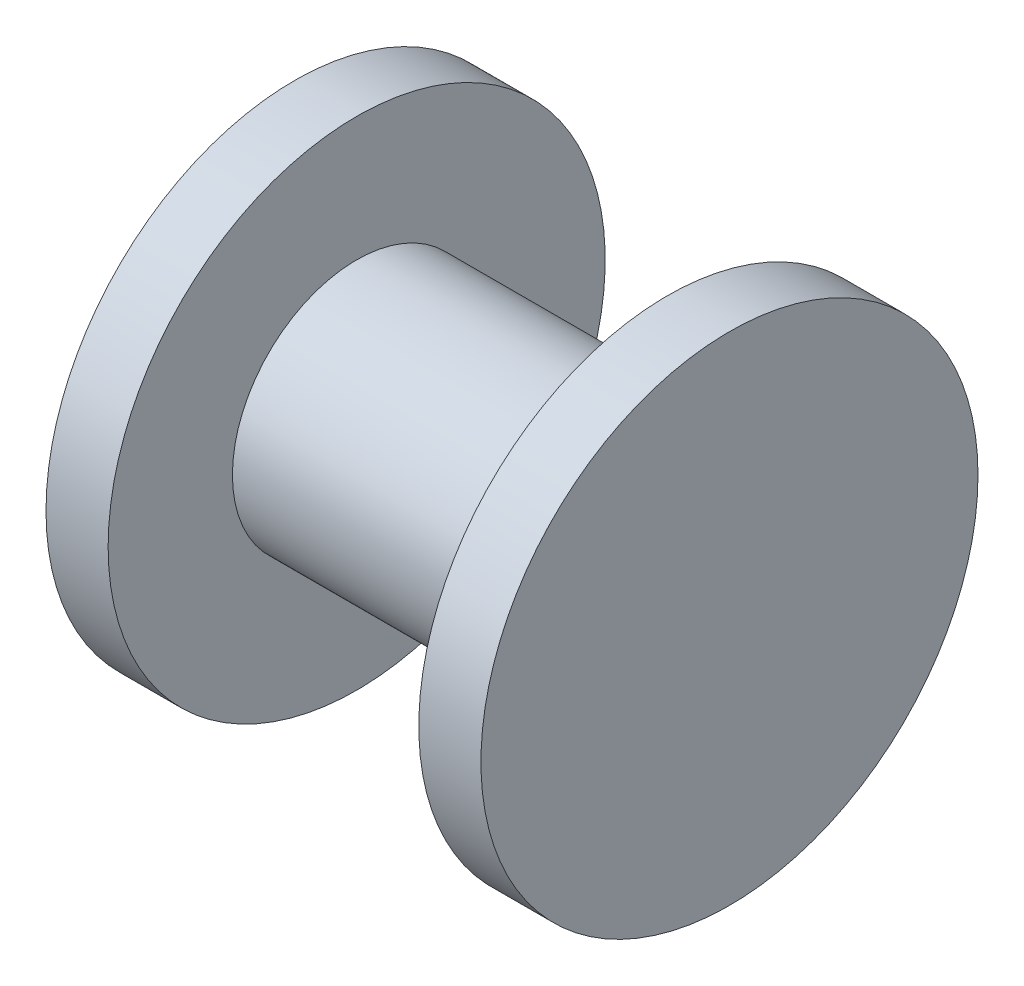
ISO-10303-21;
HEADER;
FILE_DESCRIPTION(('STEP AP214'),'2;1');
FILE_NAME('part.step','',(''),(''),'','','');
FILE_SCHEMA(('AUTOMOTIVE_DESIGN { 1 0 10303 214 1 1 1 1 }'));
ENDSEC;
DATA;
#1=APPLICATION_CONTEXT('core data for automotive mechanical design processes');
#2=APPLICATION_PROTOCOL_DEFINITION('international standard','automotive_design',2000,#1);
#3=PRODUCT_CONTEXT('',#1,'mechanical');
#4=PRODUCT('Part','Part','',(#3));
#5=PRODUCT_RELATED_PRODUCT_CATEGORY('part','',(#4));
#6=PRODUCT_DEFINITION_FORMATION('','',#4);
#7=PRODUCT_DEFINITION_CONTEXT('part definition',#1,'design');
#8=PRODUCT_DEFINITION('design','',#6,#7);
#9=PRODUCT_DEFINITION_SHAPE('','',#8);
#10=(LENGTH_UNIT() NAMED_UNIT(*) SI_UNIT(.MILLI.,.METRE.));
#11=(NAMED_UNIT(*) PLANE_ANGLE_UNIT() SI_UNIT($,.RADIAN.));
#12=(NAMED_UNIT(*) SI_UNIT($,.STERADIAN.) SOLID_ANGLE_UNIT());
#13=UNCERTAINTY_MEASURE_WITH_UNIT(LENGTH_MEASURE(1.E-05),#10,'distance_accuracy_value','');
#14=(GEOMETRIC_REPRESENTATION_CONTEXT(3) GLOBAL_UNCERTAINTY_ASSIGNED_CONTEXT((#13)) GLOBAL_UNIT_ASSIGNED_CONTEXT((#10,
#11,#12)) REPRESENTATION_CONTEXT('',''));
#15=CARTESIAN_POINT('',(0.,0.,0.));
#16=DIRECTION('',(0.,0.,1.));
#17=DIRECTION('',(1.,0.,0.));
#18=AXIS2_PLACEMENT_3D('',#15,#16,#17);
#19=CARTESIAN_POINT('',(0.,0.,0.));
#20=DIRECTION('',(-1.,0.,0.));
#21=DIRECTION('',(0.,0.,1.));
#22=AXIS2_PLACEMENT_3D('',#19,#20,#21);
#23=CYLINDRICAL_SURFACE('',#22,10.);
#24=CARTESIAN_POINT('',(-12.5,0.,0.));
#25=DIRECTION('',(-1.,0.,0.));
#26=DIRECTION('',(0.,0.,1.));
#27=AXIS2_PLACEMENT_3D('',#24,#25,#26);
#28=CIRCLE('',#27,10.);
#29=CARTESIAN_POINT('',(-12.5,0.,10.));
#30=VERTEX_POINT('',#29);
#31=EDGE_CURVE('E10',#30,#30,#28,.T.);
#32=ORIENTED_EDGE('',*,*,#31,.F.);
#33=EDGE_LOOP('',(#32));
#34=FACE_BOUND('',#33,.T.);
#35=CARTESIAN_POINT('',(12.5,0.,0.));
#36=DIRECTION('',(-1.,0.,0.));
#37=DIRECTION('',(0.,0.,1.));
#38=AXIS2_PLACEMENT_3D('',#35,#36,#37);
#39=CIRCLE('',#38,10.);
#40=CARTESIAN_POINT('',(12.5,0.,10.));
#41=VERTEX_POINT('',#40);
#42=EDGE_CURVE('E45',#41,#41,#39,.T.);
#43=ORIENTED_EDGE('',*,*,#42,.T.);
#44=EDGE_LOOP('',(#43));
#45=FACE_BOUND('',#44,.T.);
#46=ADVANCED_FACE('F39',(#34,#45),#23,.T.);
#47=CARTESIAN_POINT('',(-17.5,0.,0.));
#48=DIRECTION('',(1.,0.,0.));
#49=DIRECTION('',(0.,0.,-1.));
#50=AXIS2_PLACEMENT_3D('',#47,#48,#49);
#51=CYLINDRICAL_SURFACE('',#50,20.);
#52=CARTESIAN_POINT('',(-17.5,0.,0.));
#53=DIRECTION('',(-1.,0.,0.));
#54=DIRECTION('',(0.,0.,1.));
#55=AXIS2_PLACEMENT_3D('',#52,#53,#54);
#56=CIRCLE('',#55,20.);
#57=CARTESIAN_POINT('',(-17.5,0.,20.));
#58=VERTEX_POINT('',#57);
#59=EDGE_CURVE('E46',#58,#58,#56,.T.);
#60=ORIENTED_EDGE('',*,*,#59,.F.);
#61=EDGE_LOOP('',(#60));
#62=FACE_BOUND('',#61,.T.);
#63=CARTESIAN_POINT('',(-12.5,0.,0.));
#64=DIRECTION('',(-1.,0.,0.));
#65=DIRECTION('',(0.,0.,1.));
#66=AXIS2_PLACEMENT_3D('',#63,#64,#65);
#67=CIRCLE('',#66,20.);
#68=CARTESIAN_POINT('',(-12.5,0.,20.));
#69=VERTEX_POINT('',#68);
#70=EDGE_CURVE('E49',#69,#69,#67,.T.);
#71=ORIENTED_EDGE('',*,*,#70,.T.);
#72=EDGE_LOOP('',(#71));
#73=FACE_BOUND('',#72,.T.);
#74=ADVANCED_FACE('F87',(#62,#73),#51,.T.);
#75=CARTESIAN_POINT('',(-17.5,0.,0.));
#76=DIRECTION('',(-1.,0.,0.));
#77=DIRECTION('',(0.,0.,1.));
#78=AXIS2_PLACEMENT_3D('',#75,#76,#77);
#79=PLANE('',#78);
#80=ORIENTED_EDGE('',*,*,#59,.T.);
#81=EDGE_LOOP('',(#80));
#82=FACE_BOUND('',#81,.T.);
#83=ADVANCED_FACE('F82',(#82),#79,.T.);
#84=CARTESIAN_POINT('',(-12.5,0.,0.));
#85=DIRECTION('',(-1.,0.,0.));
#86=DIRECTION('',(0.,0.,1.));
#87=AXIS2_PLACEMENT_3D('',#84,#85,#86);
#88=PLANE('',#87);
#89=ORIENTED_EDGE('',*,*,#31,.T.);
#90=EDGE_LOOP('',(#89));
#91=FACE_BOUND('',#90,.T.);
#92=ORIENTED_EDGE('',*,*,#70,.F.);
#93=EDGE_LOOP('',(#92));
#94=FACE_BOUND('',#93,.T.);
#95=ADVANCED_FACE('F73',(#91,#94),#88,.F.);
#96=CARTESIAN_POINT('',(17.5,0.,0.));
#97=DIRECTION('',(-1.,0.,0.));
#98=DIRECTION('',(0.,0.,1.));
#99=AXIS2_PLACEMENT_3D('',#96,#97,#98);
#100=CYLINDRICAL_SURFACE('',#99,20.);
#101=CARTESIAN_POINT('',(17.5,0.,0.));
#102=DIRECTION('',(1.,0.,0.));
#103=DIRECTION('',(0.,0.,-1.));
#104=AXIS2_PLACEMENT_3D('',#101,#102,#103);
#105=CIRCLE('',#104,20.);
#106=CARTESIAN_POINT('',(17.5,0.,-20.));
#107=VERTEX_POINT('',#106);
#108=EDGE_CURVE('E59',#107,#107,#105,.T.);
#109=ORIENTED_EDGE('',*,*,#108,.F.);
#110=EDGE_LOOP('',(#109));
#111=FACE_BOUND('',#110,.T.);
#112=CARTESIAN_POINT('',(12.5,0.,0.));
#113=DIRECTION('',(1.,0.,0.));
#114=DIRECTION('',(0.,0.,-1.));
#115=AXIS2_PLACEMENT_3D('',#112,#113,#114);
#116=CIRCLE('',#115,20.);
#117=CARTESIAN_POINT('',(12.5,0.,-20.));
#118=VERTEX_POINT('',#117);
#119=EDGE_CURVE('E54',#118,#118,#116,.T.);
#120=ORIENTED_EDGE('',*,*,#119,.T.);
#121=EDGE_LOOP('',(#120));
#122=FACE_BOUND('',#121,.T.);
#123=ADVANCED_FACE('F71',(#111,#122),#100,.T.);
#124=CARTESIAN_POINT('',(17.5,0.,0.));
#125=DIRECTION('',(1.,0.,0.));
#126=DIRECTION('',(0.,0.,-1.));
#127=AXIS2_PLACEMENT_3D('',#124,#125,#126);
#128=PLANE('',#127);
#129=ORIENTED_EDGE('',*,*,#108,.T.);
#130=EDGE_LOOP('',(#129));
#131=FACE_BOUND('',#130,.T.);
#132=ADVANCED_FACE('F68',(#131),#128,.T.);
#133=CARTESIAN_POINT('',(12.5,0.,0.));
#134=DIRECTION('',(1.,0.,0.));
#135=DIRECTION('',(0.,0.,-1.));
#136=AXIS2_PLACEMENT_3D('',#133,#134,#135);
#137=PLANE('',#136);
#138=ORIENTED_EDGE('',*,*,#42,.F.);
#139=EDGE_LOOP('',(#138));
#140=FACE_BOUND('',#139,.T.);
#141=ORIENTED_EDGE('',*,*,#119,.F.);
#142=EDGE_LOOP('',(#141));
#143=FACE_BOUND('',#142,.T.);
#144=ADVANCED_FACE('F66',(#140,#143),#137,.F.);
#145=CLOSED_SHELL('',(#46,#74,#83,#95,#123,#132,#144));
#146=MANIFOLD_SOLID_BREP('B2',#145);
#147=ADVANCED_BREP_SHAPE_REPRESENTATION('',(#18,#146),#14);
#148=SHAPE_DEFINITION_REPRESENTATION(#9,#147);
ENDSEC;
END-ISO-10303-21;
